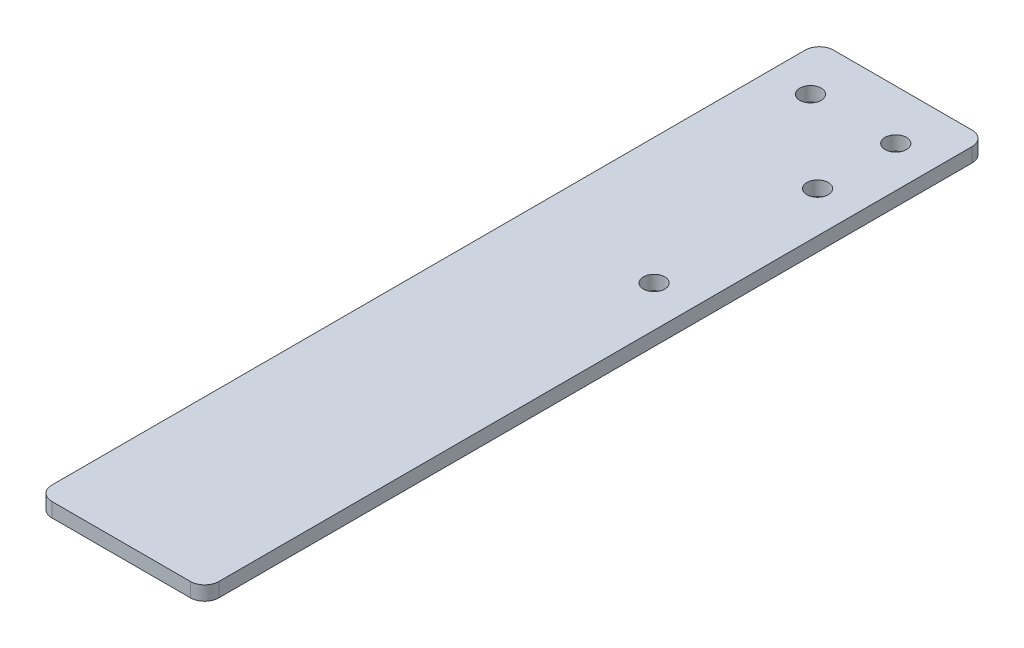
ISO-10303-21;
HEADER;
FILE_DESCRIPTION(('STEP AP214'),'2;1');
FILE_NAME('part.step','',(''),(''),'','','');
FILE_SCHEMA(('AUTOMOTIVE_DESIGN { 1 0 10303 214 1 1 1 1 }'));
ENDSEC;
DATA;
#1=APPLICATION_CONTEXT('core data for automotive mechanical design processes');
#2=APPLICATION_PROTOCOL_DEFINITION('international standard','automotive_design',2000,#1);
#3=PRODUCT_CONTEXT('',#1,'mechanical');
#4=PRODUCT('Part','Part','',(#3));
#5=PRODUCT_RELATED_PRODUCT_CATEGORY('part','',(#4));
#6=PRODUCT_DEFINITION_FORMATION('','',#4);
#7=PRODUCT_DEFINITION_CONTEXT('part definition',#1,'design');
#8=PRODUCT_DEFINITION('design','',#6,#7);
#9=PRODUCT_DEFINITION_SHAPE('','',#8);
#10=(LENGTH_UNIT() NAMED_UNIT(*) SI_UNIT(.MILLI.,.METRE.));
#11=(NAMED_UNIT(*) PLANE_ANGLE_UNIT() SI_UNIT($,.RADIAN.));
#12=(NAMED_UNIT(*) SI_UNIT($,.STERADIAN.) SOLID_ANGLE_UNIT());
#13=UNCERTAINTY_MEASURE_WITH_UNIT(LENGTH_MEASURE(1.E-05),#10,'distance_accuracy_value','');
#14=(GEOMETRIC_REPRESENTATION_CONTEXT(3) GLOBAL_UNCERTAINTY_ASSIGNED_CONTEXT((#13)) GLOBAL_UNIT_ASSIGNED_CONTEXT((#10,
#11,#12)) REPRESENTATION_CONTEXT('',''));
#15=CARTESIAN_POINT('',(0.,0.,0.));
#16=DIRECTION('',(0.,0.,1.));
#17=DIRECTION('',(1.,0.,0.));
#18=AXIS2_PLACEMENT_3D('',#15,#16,#17);
#19=CARTESIAN_POINT('',(0.,0.,110.));
#20=DIRECTION('',(0.,1.,0.));
#21=DIRECTION('',(0.,0.,1.));
#22=AXIS2_PLACEMENT_3D('',#19,#20,#21);
#23=PLANE('',#22);
#24=CARTESIAN_POINT('',(5.75,0.,7.));
#25=DIRECTION('',(0.,1.,0.));
#26=DIRECTION('',(0.,0.,1.));
#27=AXIS2_PLACEMENT_3D('',#24,#25,#26);
#28=CIRCLE('',#27,1.5);
#29=CARTESIAN_POINT('',(5.75,0.,8.5));
#30=VERTEX_POINT('',#29);
#31=EDGE_CURVE('E160',#30,#30,#28,.T.);
#32=ORIENTED_EDGE('',*,*,#31,.T.);
#33=EDGE_LOOP('',(#32));
#34=FACE_BOUND('',#33,.T.);
#35=CARTESIAN_POINT('',(17.75,0.,18.));
#36=DIRECTION('',(0.,1.,0.));
#37=DIRECTION('',(0.,0.,1.));
#38=AXIS2_PLACEMENT_3D('',#35,#36,#37);
#39=CIRCLE('',#38,1.5);
#40=CARTESIAN_POINT('',(17.75,0.,19.5));
#41=VERTEX_POINT('',#40);
#42=EDGE_CURVE('E200',#41,#41,#39,.T.);
#43=ORIENTED_EDGE('',*,*,#42,.T.);
#44=EDGE_LOOP('',(#43));
#45=FACE_BOUND('',#44,.T.);
#46=CARTESIAN_POINT('',(17.75,0.,41.));
#47=DIRECTION('',(0.,1.,0.));
#48=DIRECTION('',(0.,0.,1.));
#49=AXIS2_PLACEMENT_3D('',#46,#47,#48);
#50=CIRCLE('',#49,1.5);
#51=CARTESIAN_POINT('',(17.75,0.,42.5));
#52=VERTEX_POINT('',#51);
#53=EDGE_CURVE('E194',#52,#52,#50,.T.);
#54=ORIENTED_EDGE('',*,*,#53,.T.);
#55=EDGE_LOOP('',(#54));
#56=FACE_BOUND('',#55,.T.);
#57=CARTESIAN_POINT('',(17.75,0.,7.));
#58=DIRECTION('',(0.,1.,0.));
#59=DIRECTION('',(0.,0.,-1.));
#60=AXIS2_PLACEMENT_3D('',#57,#58,#59);
#61=CIRCLE('',#60,1.5);
#62=CARTESIAN_POINT('',(17.75,0.,5.5));
#63=VERTEX_POINT('',#62);
#64=EDGE_CURVE('E188',#63,#63,#61,.T.);
#65=ORIENTED_EDGE('',*,*,#64,.T.);
#66=EDGE_LOOP('',(#65));
#67=FACE_BOUND('',#66,.T.);
#68=DIRECTION('',(1.,0.,0.));
#69=VECTOR('',#68,1.);
#70=CARTESIAN_POINT('',(0.,0.,110.));
#71=LINE('',#70,#69);
#72=CARTESIAN_POINT('',(2.,0.,110.));
#73=VERTEX_POINT('',#72);
#74=CARTESIAN_POINT('',(21.5,0.,110.));
#75=VERTEX_POINT('',#74);
#76=EDGE_CURVE('E107',#73,#75,#71,.T.);
#77=ORIENTED_EDGE('',*,*,#76,.F.);
#78=CARTESIAN_POINT('',(2.,0.,108.));
#79=DIRECTION('',(0.,1.,0.));
#80=DIRECTION('',(0.,0.,1.));
#81=AXIS2_PLACEMENT_3D('',#78,#79,#80);
#82=CIRCLE('',#81,2.);
#83=CARTESIAN_POINT('',(0.,0.,108.));
#84=VERTEX_POINT('',#83);
#85=EDGE_CURVE('E102',#73,#84,#82,.F.);
#86=ORIENTED_EDGE('',*,*,#85,.T.);
#87=DIRECTION('',(0.,0.,-1.));
#88=VECTOR('',#87,1.);
#89=CARTESIAN_POINT('',(0.,0.,110.));
#90=LINE('',#89,#88);
#91=CARTESIAN_POINT('',(0.,0.,2.));
#92=VERTEX_POINT('',#91);
#93=EDGE_CURVE('E104',#84,#92,#90,.T.);
#94=ORIENTED_EDGE('',*,*,#93,.T.);
#95=CARTESIAN_POINT('',(2.,0.,2.));
#96=DIRECTION('',(0.,1.,0.));
#97=DIRECTION('',(0.,0.,1.));
#98=AXIS2_PLACEMENT_3D('',#95,#96,#97);
#99=CIRCLE('',#98,2.);
#100=CARTESIAN_POINT('',(2.,0.,0.));
#101=VERTEX_POINT('',#100);
#102=EDGE_CURVE('E143',#92,#101,#99,.F.);
#103=ORIENTED_EDGE('',*,*,#102,.T.);
#104=DIRECTION('',(1.,0.,0.));
#105=VECTOR('',#104,1.);
#106=CARTESIAN_POINT('',(0.,0.,0.));
#107=LINE('',#106,#105);
#108=CARTESIAN_POINT('',(21.5,0.,0.));
#109=VERTEX_POINT('',#108);
#110=EDGE_CURVE('E154',#101,#109,#107,.T.);
#111=ORIENTED_EDGE('',*,*,#110,.T.);
#112=CARTESIAN_POINT('',(21.5,0.,2.));
#113=DIRECTION('',(0.,1.,0.));
#114=DIRECTION('',(0.,0.,1.));
#115=AXIS2_PLACEMENT_3D('',#112,#113,#114);
#116=CIRCLE('',#115,2.);
#117=CARTESIAN_POINT('',(23.5,0.,2.));
#118=VERTEX_POINT('',#117);
#119=EDGE_CURVE('E50',#109,#118,#116,.F.);
#120=ORIENTED_EDGE('',*,*,#119,.T.);
#121=DIRECTION('',(0.,0.,-1.));
#122=VECTOR('',#121,1.);
#123=CARTESIAN_POINT('',(23.5,0.,110.));
#124=LINE('',#123,#122);
#125=CARTESIAN_POINT('',(23.5,0.,108.));
#126=VERTEX_POINT('',#125);
#127=EDGE_CURVE('E130',#126,#118,#124,.T.);
#128=ORIENTED_EDGE('',*,*,#127,.F.);
#129=CARTESIAN_POINT('',(21.5,0.,108.));
#130=DIRECTION('',(0.,1.,0.));
#131=DIRECTION('',(0.,0.,1.));
#132=AXIS2_PLACEMENT_3D('',#129,#130,#131);
#133=CIRCLE('',#132,2.);
#134=EDGE_CURVE('E58',#126,#75,#133,.F.);
#135=ORIENTED_EDGE('',*,*,#134,.T.);
#136=EDGE_LOOP('',(#77,#86,#94,#103,#111,#120,#128,#135));
#137=FACE_BOUND('',#136,.T.);
#138=ADVANCED_FACE('F35',(#34,#45,#56,#67,#137),#23,.F.);
#139=CARTESIAN_POINT('',(23.5,2.,110.));
#140=DIRECTION('',(1.,0.,0.));
#141=DIRECTION('',(0.,0.,-1.));
#142=AXIS2_PLACEMENT_3D('',#139,#140,#141);
#143=PLANE('',#142);
#144=DIRECTION('',(0.,0.,-1.));
#145=VECTOR('',#144,1.);
#146=CARTESIAN_POINT('',(23.5,2.,110.));
#147=LINE('',#146,#145);
#148=CARTESIAN_POINT('',(23.5,2.,108.));
#149=VERTEX_POINT('',#148);
#150=CARTESIAN_POINT('',(23.5,2.,2.));
#151=VERTEX_POINT('',#150);
#152=EDGE_CURVE('E170',#149,#151,#147,.T.);
#153=ORIENTED_EDGE('',*,*,#152,.F.);
#154=DIRECTION('',(0.,-1.,0.));
#155=VECTOR('',#154,1.);
#156=CARTESIAN_POINT('',(23.5,0.,108.));
#157=LINE('',#156,#155);
#158=EDGE_CURVE('E147',#149,#126,#157,.T.);
#159=ORIENTED_EDGE('',*,*,#158,.T.);
#160=ORIENTED_EDGE('',*,*,#127,.T.);
#161=DIRECTION('',(0.,-1.,0.));
#162=VECTOR('',#161,1.);
#163=CARTESIAN_POINT('',(23.5,2.,2.));
#164=LINE('',#163,#162);
#165=EDGE_CURVE('E111',#118,#151,#164,.F.);
#166=ORIENTED_EDGE('',*,*,#165,.T.);
#167=EDGE_LOOP('',(#153,#159,#160,#166));
#168=FACE_BOUND('',#167,.T.);
#169=ADVANCED_FACE('F175',(#168),#143,.T.);
#170=CARTESIAN_POINT('',(0.,2.,110.));
#171=DIRECTION('',(0.,1.,0.));
#172=DIRECTION('',(0.,0.,1.));
#173=AXIS2_PLACEMENT_3D('',#170,#171,#172);
#174=PLANE('',#173);
#175=CARTESIAN_POINT('',(5.75,2.,7.));
#176=DIRECTION('',(0.,1.,0.));
#177=DIRECTION('',(0.,0.,1.));
#178=AXIS2_PLACEMENT_3D('',#175,#176,#177);
#179=CIRCLE('',#178,1.5);
#180=CARTESIAN_POINT('',(5.75,2.,8.5));
#181=VERTEX_POINT('',#180);
#182=EDGE_CURVE('E164',#181,#181,#179,.T.);
#183=ORIENTED_EDGE('',*,*,#182,.F.);
#184=EDGE_LOOP('',(#183));
#185=FACE_BOUND('',#184,.T.);
#186=CARTESIAN_POINT('',(17.75,2.,18.));
#187=DIRECTION('',(0.,1.,0.));
#188=DIRECTION('',(0.,0.,1.));
#189=AXIS2_PLACEMENT_3D('',#186,#187,#188);
#190=CIRCLE('',#189,1.5);
#191=CARTESIAN_POINT('',(17.75,2.,19.5));
#192=VERTEX_POINT('',#191);
#193=EDGE_CURVE('E197',#192,#192,#190,.T.);
#194=ORIENTED_EDGE('',*,*,#193,.F.);
#195=EDGE_LOOP('',(#194));
#196=FACE_BOUND('',#195,.T.);
#197=CARTESIAN_POINT('',(17.75,2.,41.));
#198=DIRECTION('',(0.,1.,0.));
#199=DIRECTION('',(0.,0.,1.));
#200=AXIS2_PLACEMENT_3D('',#197,#198,#199);
#201=CIRCLE('',#200,1.5);
#202=CARTESIAN_POINT('',(17.75,2.,42.5));
#203=VERTEX_POINT('',#202);
#204=EDGE_CURVE('E191',#203,#203,#201,.T.);
#205=ORIENTED_EDGE('',*,*,#204,.F.);
#206=EDGE_LOOP('',(#205));
#207=FACE_BOUND('',#206,.T.);
#208=CARTESIAN_POINT('',(17.75,2.,7.));
#209=DIRECTION('',(0.,1.,0.));
#210=DIRECTION('',(0.,0.,-1.));
#211=AXIS2_PLACEMENT_3D('',#208,#209,#210);
#212=CIRCLE('',#211,1.5);
#213=CARTESIAN_POINT('',(17.75,2.,5.5));
#214=VERTEX_POINT('',#213);
#215=EDGE_CURVE('E185',#214,#214,#212,.T.);
#216=ORIENTED_EDGE('',*,*,#215,.F.);
#217=EDGE_LOOP('',(#216));
#218=FACE_BOUND('',#217,.T.);
#219=DIRECTION('',(0.,0.,-1.));
#220=VECTOR('',#219,1.);
#221=CARTESIAN_POINT('',(0.,2.,110.));
#222=LINE('',#221,#220);
#223=CARTESIAN_POINT('',(0.,2.,108.));
#224=VERTEX_POINT('',#223);
#225=CARTESIAN_POINT('',(0.,2.,2.));
#226=VERTEX_POINT('',#225);
#227=EDGE_CURVE('E121',#224,#226,#222,.T.);
#228=ORIENTED_EDGE('',*,*,#227,.F.);
#229=CARTESIAN_POINT('',(2.,2.,108.));
#230=DIRECTION('',(0.,1.,0.));
#231=DIRECTION('',(0.,0.,1.));
#232=AXIS2_PLACEMENT_3D('',#229,#230,#231);
#233=CIRCLE('',#232,2.);
#234=CARTESIAN_POINT('',(2.,2.,110.));
#235=VERTEX_POINT('',#234);
#236=EDGE_CURVE('E125',#224,#235,#233,.T.);
#237=ORIENTED_EDGE('',*,*,#236,.T.);
#238=DIRECTION('',(1.,0.,0.));
#239=VECTOR('',#238,1.);
#240=CARTESIAN_POINT('',(0.,2.,110.));
#241=LINE('',#240,#239);
#242=CARTESIAN_POINT('',(21.5,2.,110.));
#243=VERTEX_POINT('',#242);
#244=EDGE_CURVE('E122',#235,#243,#241,.T.);
#245=ORIENTED_EDGE('',*,*,#244,.T.);
#246=CARTESIAN_POINT('',(21.5,2.,108.));
#247=DIRECTION('',(0.,1.,0.));
#248=DIRECTION('',(0.,0.,1.));
#249=AXIS2_PLACEMENT_3D('',#246,#247,#248);
#250=CIRCLE('',#249,2.);
#251=EDGE_CURVE('E135',#243,#149,#250,.T.);
#252=ORIENTED_EDGE('',*,*,#251,.T.);
#253=ORIENTED_EDGE('',*,*,#152,.T.);
#254=CARTESIAN_POINT('',(21.5,2.,2.));
#255=DIRECTION('',(0.,1.,0.));
#256=DIRECTION('',(0.,0.,1.));
#257=AXIS2_PLACEMENT_3D('',#254,#255,#256);
#258=CIRCLE('',#257,2.);
#259=CARTESIAN_POINT('',(21.5,2.,0.));
#260=VERTEX_POINT('',#259);
#261=EDGE_CURVE('E126',#151,#260,#258,.T.);
#262=ORIENTED_EDGE('',*,*,#261,.T.);
#263=DIRECTION('',(1.,0.,0.));
#264=VECTOR('',#263,1.);
#265=CARTESIAN_POINT('',(0.,2.,0.));
#266=LINE('',#265,#264);
#267=CARTESIAN_POINT('',(2.,2.,0.));
#268=VERTEX_POINT('',#267);
#269=EDGE_CURVE('E157',#268,#260,#266,.T.);
#270=ORIENTED_EDGE('',*,*,#269,.F.);
#271=CARTESIAN_POINT('',(2.,2.,2.));
#272=DIRECTION('',(0.,1.,0.));
#273=DIRECTION('',(0.,0.,1.));
#274=AXIS2_PLACEMENT_3D('',#271,#272,#273);
#275=CIRCLE('',#274,2.);
#276=EDGE_CURVE('E128',#268,#226,#275,.T.);
#277=ORIENTED_EDGE('',*,*,#276,.T.);
#278=EDGE_LOOP('',(#228,#237,#245,#252,#253,#262,#270,#277));
#279=FACE_BOUND('',#278,.T.);
#280=ADVANCED_FACE('F177',(#185,#196,#207,#218,#279),#174,.T.);
#281=CARTESIAN_POINT('',(0.,0.,110.));
#282=DIRECTION('',(-1.,0.,0.));
#283=DIRECTION('',(0.,0.,1.));
#284=AXIS2_PLACEMENT_3D('',#281,#282,#283);
#285=PLANE('',#284);
#286=ORIENTED_EDGE('',*,*,#93,.F.);
#287=DIRECTION('',(0.,1.,0.));
#288=VECTOR('',#287,1.);
#289=CARTESIAN_POINT('',(0.,2.,108.));
#290=LINE('',#289,#288);
#291=EDGE_CURVE('E117',#84,#224,#290,.T.);
#292=ORIENTED_EDGE('',*,*,#291,.T.);
#293=ORIENTED_EDGE('',*,*,#227,.T.);
#294=DIRECTION('',(0.,1.,0.));
#295=VECTOR('',#294,1.);
#296=CARTESIAN_POINT('',(0.,0.,2.));
#297=LINE('',#296,#295);
#298=EDGE_CURVE('E120',#226,#92,#297,.F.);
#299=ORIENTED_EDGE('',*,*,#298,.T.);
#300=EDGE_LOOP('',(#286,#292,#293,#299));
#301=FACE_BOUND('',#300,.T.);
#302=ADVANCED_FACE('F115',(#301),#285,.T.);
#303=CARTESIAN_POINT('',(0.,0.,110.));
#304=DIRECTION('',(0.,0.,-1.));
#305=DIRECTION('',(-1.,0.,0.));
#306=AXIS2_PLACEMENT_3D('',#303,#304,#305);
#307=PLANE('',#306);
#308=ORIENTED_EDGE('',*,*,#244,.F.);
#309=DIRECTION('',(0.,1.,0.));
#310=VECTOR('',#309,1.);
#311=CARTESIAN_POINT('',(2.,0.,110.));
#312=LINE('',#311,#310);
#313=EDGE_CURVE('E140',#235,#73,#312,.F.);
#314=ORIENTED_EDGE('',*,*,#313,.T.);
#315=ORIENTED_EDGE('',*,*,#76,.T.);
#316=DIRECTION('',(0.,-1.,0.));
#317=VECTOR('',#316,1.);
#318=CARTESIAN_POINT('',(21.5,2.,110.));
#319=LINE('',#318,#317);
#320=EDGE_CURVE('E138',#75,#243,#319,.F.);
#321=ORIENTED_EDGE('',*,*,#320,.T.);
#322=EDGE_LOOP('',(#308,#314,#315,#321));
#323=FACE_BOUND('',#322,.T.);
#324=ADVANCED_FACE('F183',(#323),#307,.F.);
#325=CARTESIAN_POINT('',(0.,0.,0.));
#326=DIRECTION('',(0.,0.,-1.));
#327=DIRECTION('',(-1.,0.,0.));
#328=AXIS2_PLACEMENT_3D('',#325,#326,#327);
#329=PLANE('',#328);
#330=ORIENTED_EDGE('',*,*,#110,.F.);
#331=DIRECTION('',(0.,1.,0.));
#332=VECTOR('',#331,1.);
#333=CARTESIAN_POINT('',(2.,0.,0.));
#334=LINE('',#333,#332);
#335=EDGE_CURVE('E11',#101,#268,#334,.T.);
#336=ORIENTED_EDGE('',*,*,#335,.T.);
#337=ORIENTED_EDGE('',*,*,#269,.T.);
#338=DIRECTION('',(0.,-1.,0.));
#339=VECTOR('',#338,1.);
#340=CARTESIAN_POINT('',(21.5,0.,0.));
#341=LINE('',#340,#339);
#342=EDGE_CURVE('E43',#260,#109,#341,.T.);
#343=ORIENTED_EDGE('',*,*,#342,.T.);
#344=EDGE_LOOP('',(#330,#336,#337,#343));
#345=FACE_BOUND('',#344,.T.);
#346=ADVANCED_FACE('F153',(#345),#329,.T.);
#347=CARTESIAN_POINT('',(17.75,0.,7.));
#348=DIRECTION('',(0.,1.,0.));
#349=DIRECTION('',(0.,0.,1.));
#350=AXIS2_PLACEMENT_3D('',#347,#348,#349);
#351=CYLINDRICAL_SURFACE('',#350,1.5);
#352=ORIENTED_EDGE('',*,*,#64,.F.);
#353=EDGE_LOOP('',(#352));
#354=FACE_BOUND('',#353,.T.);
#355=ORIENTED_EDGE('',*,*,#215,.T.);
#356=EDGE_LOOP('',(#355));
#357=FACE_BOUND('',#356,.T.);
#358=ADVANCED_FACE('F217',(#354,#357),#351,.F.);
#359=CARTESIAN_POINT('',(17.75,0.,41.));
#360=DIRECTION('',(0.,1.,0.));
#361=DIRECTION('',(0.,0.,1.));
#362=AXIS2_PLACEMENT_3D('',#359,#360,#361);
#363=CYLINDRICAL_SURFACE('',#362,1.5);
#364=ORIENTED_EDGE('',*,*,#53,.F.);
#365=EDGE_LOOP('',(#364));
#366=FACE_BOUND('',#365,.T.);
#367=ORIENTED_EDGE('',*,*,#204,.T.);
#368=EDGE_LOOP('',(#367));
#369=FACE_BOUND('',#368,.T.);
#370=ADVANCED_FACE('F219',(#366,#369),#363,.F.);
#371=CARTESIAN_POINT('',(17.75,0.,18.));
#372=DIRECTION('',(0.,1.,0.));
#373=DIRECTION('',(0.,0.,1.));
#374=AXIS2_PLACEMENT_3D('',#371,#372,#373);
#375=CYLINDRICAL_SURFACE('',#374,1.5);
#376=ORIENTED_EDGE('',*,*,#42,.F.);
#377=EDGE_LOOP('',(#376));
#378=FACE_BOUND('',#377,.T.);
#379=ORIENTED_EDGE('',*,*,#193,.T.);
#380=EDGE_LOOP('',(#379));
#381=FACE_BOUND('',#380,.T.);
#382=ADVANCED_FACE('F226',(#378,#381),#375,.F.);
#383=CARTESIAN_POINT('',(5.75,0.,7.));
#384=DIRECTION('',(0.,1.,0.));
#385=DIRECTION('',(0.,0.,1.));
#386=AXIS2_PLACEMENT_3D('',#383,#384,#385);
#387=CYLINDRICAL_SURFACE('',#386,1.5);
#388=ORIENTED_EDGE('',*,*,#31,.F.);
#389=EDGE_LOOP('',(#388));
#390=FACE_BOUND('',#389,.T.);
#391=ORIENTED_EDGE('',*,*,#182,.T.);
#392=EDGE_LOOP('',(#391));
#393=FACE_BOUND('',#392,.T.);
#394=ADVANCED_FACE('F206',(#390,#393),#387,.F.);
#395=CARTESIAN_POINT('',(2.,0.,108.));
#396=DIRECTION('',(0.,-1.,0.));
#397=DIRECTION('',(0.,0.,-1.));
#398=AXIS2_PLACEMENT_3D('',#395,#396,#397);
#399=CYLINDRICAL_SURFACE('',#398,2.);
#400=ORIENTED_EDGE('',*,*,#85,.F.);
#401=ORIENTED_EDGE('',*,*,#313,.F.);
#402=ORIENTED_EDGE('',*,*,#236,.F.);
#403=ORIENTED_EDGE('',*,*,#291,.F.);
#404=EDGE_LOOP('',(#400,#401,#402,#403));
#405=FACE_BOUND('',#404,.T.);
#406=ADVANCED_FACE('F124',(#405),#399,.T.);
#407=CARTESIAN_POINT('',(21.5,2.,108.));
#408=DIRECTION('',(0.,1.,0.));
#409=DIRECTION('',(0.,0.,1.));
#410=AXIS2_PLACEMENT_3D('',#407,#408,#409);
#411=CYLINDRICAL_SURFACE('',#410,2.);
#412=ORIENTED_EDGE('',*,*,#251,.F.);
#413=ORIENTED_EDGE('',*,*,#320,.F.);
#414=ORIENTED_EDGE('',*,*,#134,.F.);
#415=ORIENTED_EDGE('',*,*,#158,.F.);
#416=EDGE_LOOP('',(#412,#413,#414,#415));
#417=FACE_BOUND('',#416,.T.);
#418=ADVANCED_FACE('F180',(#417),#411,.T.);
#419=CARTESIAN_POINT('',(2.,0.,2.));
#420=DIRECTION('',(0.,1.,0.));
#421=DIRECTION('',(0.,0.,1.));
#422=AXIS2_PLACEMENT_3D('',#419,#420,#421);
#423=CYLINDRICAL_SURFACE('',#422,2.);
#424=ORIENTED_EDGE('',*,*,#102,.F.);
#425=ORIENTED_EDGE('',*,*,#298,.F.);
#426=ORIENTED_EDGE('',*,*,#276,.F.);
#427=ORIENTED_EDGE('',*,*,#335,.F.);
#428=EDGE_LOOP('',(#424,#425,#426,#427));
#429=FACE_BOUND('',#428,.T.);
#430=ADVANCED_FACE('F244',(#429),#423,.T.);
#431=CARTESIAN_POINT('',(21.5,0.,2.));
#432=DIRECTION('',(0.,-1.,0.));
#433=DIRECTION('',(0.,0.,-1.));
#434=AXIS2_PLACEMENT_3D('',#431,#432,#433);
#435=CYLINDRICAL_SURFACE('',#434,2.);
#436=ORIENTED_EDGE('',*,*,#261,.F.);
#437=ORIENTED_EDGE('',*,*,#165,.F.);
#438=ORIENTED_EDGE('',*,*,#119,.F.);
#439=ORIENTED_EDGE('',*,*,#342,.F.);
#440=EDGE_LOOP('',(#436,#437,#438,#439));
#441=FACE_BOUND('',#440,.T.);
#442=ADVANCED_FACE('F37',(#441),#435,.T.);
#443=CLOSED_SHELL('',(#138,#169,#280,#302,#324,#346,#358,#370,#382,#394,#406,#418,#430,#442));
#444=MANIFOLD_SOLID_BREP('B2',#443);
#445=ADVANCED_BREP_SHAPE_REPRESENTATION('',(#18,#444),#14);
#446=SHAPE_DEFINITION_REPRESENTATION(#9,#445);
ENDSEC;
END-ISO-10303-21;
